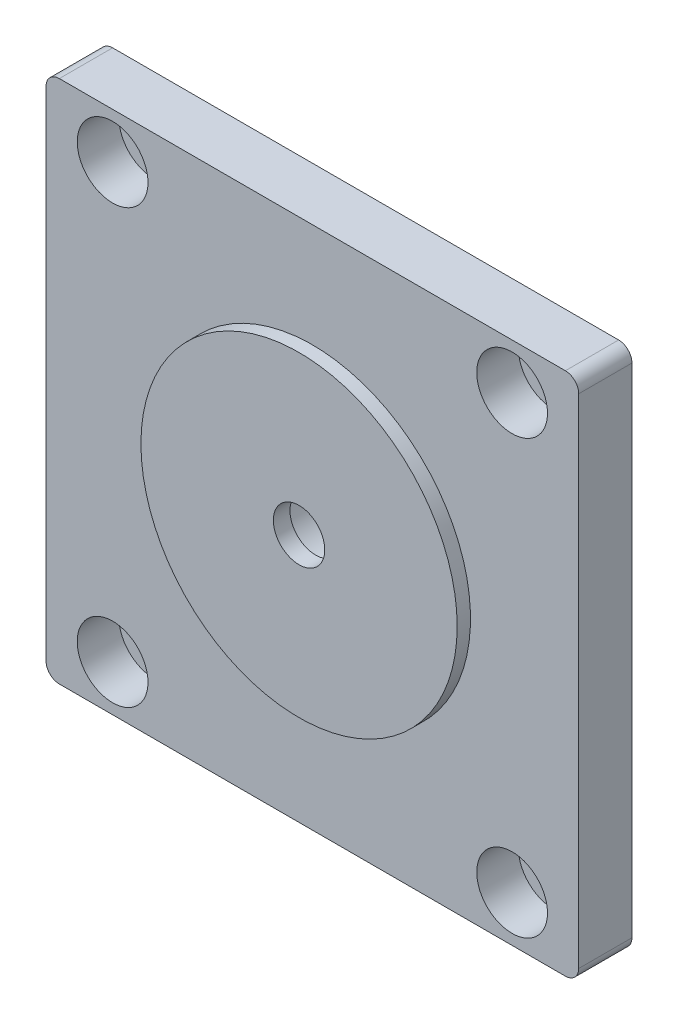
ISO-10303-21;
HEADER;
FILE_DESCRIPTION(('STEP AP214'),'2;1');
FILE_NAME('part.step','',(''),(''),'','','');
FILE_SCHEMA(('AUTOMOTIVE_DESIGN { 1 0 10303 214 1 1 1 1 }'));
ENDSEC;
DATA;
#1=APPLICATION_CONTEXT('core data for automotive mechanical design processes');
#2=APPLICATION_PROTOCOL_DEFINITION('international standard','automotive_design',2000,#1);
#3=PRODUCT_CONTEXT('',#1,'mechanical');
#4=PRODUCT('Part','Part','',(#3));
#5=PRODUCT_RELATED_PRODUCT_CATEGORY('part','',(#4));
#6=PRODUCT_DEFINITION_FORMATION('','',#4);
#7=PRODUCT_DEFINITION_CONTEXT('part definition',#1,'design');
#8=PRODUCT_DEFINITION('design','',#6,#7);
#9=PRODUCT_DEFINITION_SHAPE('','',#8);
#10=(LENGTH_UNIT() NAMED_UNIT(*) SI_UNIT(.MILLI.,.METRE.));
#11=(NAMED_UNIT(*) PLANE_ANGLE_UNIT() SI_UNIT($,.RADIAN.));
#12=(NAMED_UNIT(*) SI_UNIT($,.STERADIAN.) SOLID_ANGLE_UNIT());
#13=UNCERTAINTY_MEASURE_WITH_UNIT(LENGTH_MEASURE(1.E-05),#10,'distance_accuracy_value','');
#14=(GEOMETRIC_REPRESENTATION_CONTEXT(3) GLOBAL_UNCERTAINTY_ASSIGNED_CONTEXT((#13)) GLOBAL_UNIT_ASSIGNED_CONTEXT((#10,
#11,#12)) REPRESENTATION_CONTEXT('',''));
#15=CARTESIAN_POINT('',(0.,0.,0.));
#16=DIRECTION('',(0.,0.,1.));
#17=DIRECTION('',(1.,0.,0.));
#18=AXIS2_PLACEMENT_3D('',#15,#16,#17);
#19=CARTESIAN_POINT('',(0.,0.,10.16));
#20=DIRECTION('',(1.,0.,0.));
#21=DIRECTION('',(0.,0.,-1.));
#22=AXIS2_PLACEMENT_3D('',#19,#20,#21);
#23=PLANE('',#22);
#24=DIRECTION('',(0.,-1.,0.));
#25=VECTOR('',#24,1.);
#26=CARTESIAN_POINT('',(0.,0.,10.16));
#27=LINE('',#26,#25);
#28=CARTESIAN_POINT('',(0.,97.4725,10.16));
#29=VERTEX_POINT('',#28);
#30=CARTESIAN_POINT('',(0.,2.54,10.16));
#31=VERTEX_POINT('',#30);
#32=EDGE_CURVE('E128',#29,#31,#27,.T.);
#33=ORIENTED_EDGE('',*,*,#32,.F.);
#34=DIRECTION('',(0.,0.,-1.));
#35=VECTOR('',#34,1.);
#36=CARTESIAN_POINT('',(0.,97.4725,10.16));
#37=LINE('',#36,#35);
#38=CARTESIAN_POINT('',(0.,97.4725,0.));
#39=VERTEX_POINT('',#38);
#40=EDGE_CURVE('E155',#29,#39,#37,.T.);
#41=ORIENTED_EDGE('',*,*,#40,.T.);
#42=DIRECTION('',(0.,-1.,0.));
#43=VECTOR('',#42,1.);
#44=CARTESIAN_POINT('',(0.,0.,0.));
#45=LINE('',#44,#43);
#46=CARTESIAN_POINT('',(0.,2.54,0.));
#47=VERTEX_POINT('',#46);
#48=EDGE_CURVE('E130',#39,#47,#45,.T.);
#49=ORIENTED_EDGE('',*,*,#48,.T.);
#50=DIRECTION('',(0.,0.,-1.));
#51=VECTOR('',#50,1.);
#52=CARTESIAN_POINT('',(0.,2.54,10.16));
#53=LINE('',#52,#51);
#54=EDGE_CURVE('E153',#47,#31,#53,.F.);
#55=ORIENTED_EDGE('',*,*,#54,.T.);
#56=EDGE_LOOP('',(#33,#41,#49,#55));
#57=FACE_BOUND('',#56,.T.);
#58=ADVANCED_FACE('F35',(#57),#23,.F.);
#59=CARTESIAN_POINT('',(0.,0.,10.16));
#60=DIRECTION('',(0.,1.,0.));
#61=DIRECTION('',(0.,0.,1.));
#62=AXIS2_PLACEMENT_3D('',#59,#60,#61);
#63=PLANE('',#62);
#64=DIRECTION('',(1.,0.,0.));
#65=VECTOR('',#64,1.);
#66=CARTESIAN_POINT('',(0.,0.,0.));
#67=LINE('',#66,#65);
#68=CARTESIAN_POINT('',(2.54,0.,0.));
#69=VERTEX_POINT('',#68);
#70=CARTESIAN_POINT('',(99.06,0.,0.));
#71=VERTEX_POINT('',#70);
#72=EDGE_CURVE('E126',#69,#71,#67,.T.);
#73=ORIENTED_EDGE('',*,*,#72,.T.);
#74=DIRECTION('',(0.,0.,-1.));
#75=VECTOR('',#74,1.);
#76=CARTESIAN_POINT('',(99.06,0.,10.16));
#77=LINE('',#76,#75);
#78=CARTESIAN_POINT('',(99.06,0.,10.16));
#79=VERTEX_POINT('',#78);
#80=EDGE_CURVE('E105',#71,#79,#77,.F.);
#81=ORIENTED_EDGE('',*,*,#80,.T.);
#82=DIRECTION('',(1.,0.,0.));
#83=VECTOR('',#82,1.);
#84=CARTESIAN_POINT('',(0.,0.,10.16));
#85=LINE('',#84,#83);
#86=CARTESIAN_POINT('',(2.54,0.,10.16));
#87=VERTEX_POINT('',#86);
#88=EDGE_CURVE('E172',#87,#79,#85,.T.);
#89=ORIENTED_EDGE('',*,*,#88,.F.);
#90=DIRECTION('',(0.,0.,-1.));
#91=VECTOR('',#90,1.);
#92=CARTESIAN_POINT('',(2.54,0.,10.16));
#93=LINE('',#92,#91);
#94=EDGE_CURVE('E110',#87,#69,#93,.T.);
#95=ORIENTED_EDGE('',*,*,#94,.T.);
#96=EDGE_LOOP('',(#73,#81,#89,#95));
#97=FACE_BOUND('',#96,.T.);
#98=ADVANCED_FACE('F288',(#97),#63,.F.);
#99=CARTESIAN_POINT('',(101.6,0.,10.16));
#100=DIRECTION('',(-1.,0.,0.));
#101=DIRECTION('',(0.,0.,1.));
#102=AXIS2_PLACEMENT_3D('',#99,#100,#101);
#103=PLANE('',#102);
#104=DIRECTION('',(0.,1.,0.));
#105=VECTOR('',#104,1.);
#106=CARTESIAN_POINT('',(101.6,0.,10.16));
#107=LINE('',#106,#105);
#108=CARTESIAN_POINT('',(101.6,2.54,10.16));
#109=VERTEX_POINT('',#108);
#110=CARTESIAN_POINT('',(101.6,97.4725,10.16));
#111=VERTEX_POINT('',#110);
#112=EDGE_CURVE('E119',#109,#111,#107,.T.);
#113=ORIENTED_EDGE('',*,*,#112,.F.);
#114=DIRECTION('',(0.,0.,-1.));
#115=VECTOR('',#114,1.);
#116=CARTESIAN_POINT('',(101.6,2.54,10.16));
#117=LINE('',#116,#115);
#118=CARTESIAN_POINT('',(101.6,2.54,0.));
#119=VERTEX_POINT('',#118);
#120=EDGE_CURVE('E104',#109,#119,#117,.T.);
#121=ORIENTED_EDGE('',*,*,#120,.T.);
#122=DIRECTION('',(0.,1.,0.));
#123=VECTOR('',#122,1.);
#124=CARTESIAN_POINT('',(101.6,0.,0.));
#125=LINE('',#124,#123);
#126=CARTESIAN_POINT('',(101.6,97.4725,0.));
#127=VERTEX_POINT('',#126);
#128=EDGE_CURVE('E117',#119,#127,#125,.T.);
#129=ORIENTED_EDGE('',*,*,#128,.T.);
#130=DIRECTION('',(0.,0.,-1.));
#131=VECTOR('',#130,1.);
#132=CARTESIAN_POINT('',(101.6,97.4725,10.16));
#133=LINE('',#132,#131);
#134=EDGE_CURVE('E121',#127,#111,#133,.F.);
#135=ORIENTED_EDGE('',*,*,#134,.T.);
#136=EDGE_LOOP('',(#113,#121,#129,#135));
#137=FACE_BOUND('',#136,.T.);
#138=ADVANCED_FACE('F116',(#137),#103,.F.);
#139=CARTESIAN_POINT('',(0.,100.0125,10.16));
#140=DIRECTION('',(0.,-1.,0.));
#141=DIRECTION('',(0.,0.,-1.));
#142=AXIS2_PLACEMENT_3D('',#139,#140,#141);
#143=PLANE('',#142);
#144=DIRECTION('',(-1.,0.,0.));
#145=VECTOR('',#144,1.);
#146=CARTESIAN_POINT('',(0.,100.0125,0.));
#147=LINE('',#146,#145);
#148=CARTESIAN_POINT('',(99.06,100.0125,0.));
#149=VERTEX_POINT('',#148);
#150=CARTESIAN_POINT('',(2.54,100.0125,0.));
#151=VERTEX_POINT('',#150);
#152=EDGE_CURVE('E125',#149,#151,#147,.T.);
#153=ORIENTED_EDGE('',*,*,#152,.T.);
#154=DIRECTION('',(0.,0.,-1.));
#155=VECTOR('',#154,1.);
#156=CARTESIAN_POINT('',(2.54,100.0125,10.16));
#157=LINE('',#156,#155);
#158=CARTESIAN_POINT('',(2.54,100.0125,10.16));
#159=VERTEX_POINT('',#158);
#160=EDGE_CURVE('E11',#151,#159,#157,.F.);
#161=ORIENTED_EDGE('',*,*,#160,.T.);
#162=DIRECTION('',(-1.,0.,0.));
#163=VECTOR('',#162,1.);
#164=CARTESIAN_POINT('',(0.,100.0125,10.16));
#165=LINE('',#164,#163);
#166=CARTESIAN_POINT('',(99.06,100.0125,10.16));
#167=VERTEX_POINT('',#166);
#168=EDGE_CURVE('E137',#167,#159,#165,.T.);
#169=ORIENTED_EDGE('',*,*,#168,.F.);
#170=DIRECTION('',(0.,0.,-1.));
#171=VECTOR('',#170,1.);
#172=CARTESIAN_POINT('',(99.06,100.0125,10.16));
#173=LINE('',#172,#171);
#174=EDGE_CURVE('E43',#167,#149,#173,.T.);
#175=ORIENTED_EDGE('',*,*,#174,.T.);
#176=EDGE_LOOP('',(#153,#161,#169,#175));
#177=FACE_BOUND('',#176,.T.);
#178=ADVANCED_FACE('F159',(#177),#143,.F.);
#179=CARTESIAN_POINT('',(0.,0.,10.16));
#180=DIRECTION('',(0.,0.,-1.));
#181=DIRECTION('',(-1.,0.,0.));
#182=AXIS2_PLACEMENT_3D('',#179,#180,#181);
#183=PLANE('',#182);
#184=CARTESIAN_POINT('',(50.8,50.00625,10.16));
#185=DIRECTION('',(0.,0.,-1.));
#186=DIRECTION('',(-1.,0.,0.));
#187=AXIS2_PLACEMENT_3D('',#184,#185,#186);
#188=CIRCLE('',#187,30.1625);
#189=CARTESIAN_POINT('',(20.6375,50.00625,10.16));
#190=VERTEX_POINT('',#189);
#191=EDGE_CURVE('E134',#190,#190,#188,.F.);
#192=ORIENTED_EDGE('',*,*,#191,.F.);
#193=EDGE_LOOP('',(#192));
#194=FACE_BOUND('',#193,.T.);
#195=CARTESIAN_POINT('',(88.9,91.28125,10.16));
#196=DIRECTION('',(0.,0.,1.));
#197=DIRECTION('',(1.,0.,0.));
#198=AXIS2_PLACEMENT_3D('',#195,#196,#197);
#199=CIRCLE('',#198,6.74751);
#200=CARTESIAN_POINT('',(95.64751,91.28125,10.16));
#201=VERTEX_POINT('',#200);
#202=EDGE_CURVE('E228',#201,#201,#199,.T.);
#203=ORIENTED_EDGE('',*,*,#202,.F.);
#204=EDGE_LOOP('',(#203));
#205=FACE_BOUND('',#204,.T.);
#206=CARTESIAN_POINT('',(12.7,8.73125,10.16));
#207=DIRECTION('',(0.,0.,1.));
#208=DIRECTION('',(1.,0.,0.));
#209=AXIS2_PLACEMENT_3D('',#206,#207,#208);
#210=CIRCLE('',#209,6.74751);
#211=CARTESIAN_POINT('',(19.44751,8.73125,10.16));
#212=VERTEX_POINT('',#211);
#213=EDGE_CURVE('E216',#212,#212,#210,.T.);
#214=ORIENTED_EDGE('',*,*,#213,.F.);
#215=EDGE_LOOP('',(#214));
#216=FACE_BOUND('',#215,.T.);
#217=CARTESIAN_POINT('',(12.7,91.28125,10.16));
#218=DIRECTION('',(0.,0.,1.));
#219=DIRECTION('',(1.,0.,0.));
#220=AXIS2_PLACEMENT_3D('',#217,#218,#219);
#221=CIRCLE('',#220,6.74751);
#222=CARTESIAN_POINT('',(19.44751,91.28125,10.16));
#223=VERTEX_POINT('',#222);
#224=EDGE_CURVE('E204',#223,#223,#221,.T.);
#225=ORIENTED_EDGE('',*,*,#224,.F.);
#226=EDGE_LOOP('',(#225));
#227=FACE_BOUND('',#226,.T.);
#228=CARTESIAN_POINT('',(88.9,8.73125,10.16));
#229=DIRECTION('',(0.,0.,1.));
#230=DIRECTION('',(1.,0.,0.));
#231=AXIS2_PLACEMENT_3D('',#228,#229,#230);
#232=CIRCLE('',#231,6.74751);
#233=CARTESIAN_POINT('',(95.64751,8.73125,10.16));
#234=VERTEX_POINT('',#233);
#235=EDGE_CURVE('E190',#234,#234,#232,.T.);
#236=ORIENTED_EDGE('',*,*,#235,.F.);
#237=EDGE_LOOP('',(#236));
#238=FACE_BOUND('',#237,.T.);
#239=ORIENTED_EDGE('',*,*,#88,.T.);
#240=CARTESIAN_POINT('',(99.06,2.54,10.16));
#241=DIRECTION('',(0.,0.,-1.));
#242=DIRECTION('',(-1.,0.,0.));
#243=AXIS2_PLACEMENT_3D('',#240,#241,#242);
#244=CIRCLE('',#243,2.54);
#245=EDGE_CURVE('E151',#79,#109,#244,.F.);
#246=ORIENTED_EDGE('',*,*,#245,.T.);
#247=ORIENTED_EDGE('',*,*,#112,.T.);
#248=CARTESIAN_POINT('',(99.06,97.4725,10.16));
#249=DIRECTION('',(0.,0.,-1.));
#250=DIRECTION('',(-1.,0.,0.));
#251=AXIS2_PLACEMENT_3D('',#248,#249,#250);
#252=CIRCLE('',#251,2.54);
#253=EDGE_CURVE('E55',#111,#167,#252,.F.);
#254=ORIENTED_EDGE('',*,*,#253,.T.);
#255=ORIENTED_EDGE('',*,*,#168,.T.);
#256=CARTESIAN_POINT('',(2.54,97.4725,10.16));
#257=DIRECTION('',(0.,0.,-1.));
#258=DIRECTION('',(-1.,0.,0.));
#259=AXIS2_PLACEMENT_3D('',#256,#257,#258);
#260=CIRCLE('',#259,2.54);
#261=EDGE_CURVE('E149',#159,#29,#260,.F.);
#262=ORIENTED_EDGE('',*,*,#261,.T.);
#263=ORIENTED_EDGE('',*,*,#32,.T.);
#264=CARTESIAN_POINT('',(2.54,2.54,10.16));
#265=DIRECTION('',(0.,0.,-1.));
#266=DIRECTION('',(-1.,0.,0.));
#267=AXIS2_PLACEMENT_3D('',#264,#265,#266);
#268=CIRCLE('',#267,2.54);
#269=EDGE_CURVE('E147',#31,#87,#268,.F.);
#270=ORIENTED_EDGE('',*,*,#269,.T.);
#271=EDGE_LOOP('',(#239,#246,#247,#254,#255,#262,#263,#270));
#272=FACE_BOUND('',#271,.T.);
#273=ADVANCED_FACE('F252',(#194,#205,#216,#227,#238,#272),#183,.F.);
#274=CARTESIAN_POINT('',(0.,0.,0.));
#275=DIRECTION('',(0.,0.,-1.));
#276=DIRECTION('',(-1.,0.,0.));
#277=AXIS2_PLACEMENT_3D('',#274,#275,#276);
#278=PLANE('',#277);
#279=CARTESIAN_POINT('',(50.8,50.00625,0.));
#280=DIRECTION('',(0.,0.,-1.));
#281=DIRECTION('',(-1.,0.,0.));
#282=AXIS2_PLACEMENT_3D('',#279,#280,#281);
#283=CIRCLE('',#282,7.9375);
#284=CARTESIAN_POINT('',(42.8625,50.00625,0.));
#285=VERTEX_POINT('',#284);
#286=EDGE_CURVE('E243',#285,#285,#283,.T.);
#287=ORIENTED_EDGE('',*,*,#286,.F.);
#288=EDGE_LOOP('',(#287));
#289=FACE_BOUND('',#288,.T.);
#290=CARTESIAN_POINT('',(88.9,91.28125,0.));
#291=DIRECTION('',(0.,0.,1.));
#292=DIRECTION('',(1.,0.,0.));
#293=AXIS2_PLACEMENT_3D('',#290,#291,#292);
#294=CIRCLE('',#293,4.1021);
#295=CARTESIAN_POINT('',(93.0021,91.28125,0.));
#296=VERTEX_POINT('',#295);
#297=EDGE_CURVE('E219',#296,#296,#294,.T.);
#298=ORIENTED_EDGE('',*,*,#297,.T.);
#299=EDGE_LOOP('',(#298));
#300=FACE_BOUND('',#299,.T.);
#301=CARTESIAN_POINT('',(12.7,8.73125,0.));
#302=DIRECTION('',(0.,0.,1.));
#303=DIRECTION('',(1.,0.,0.));
#304=AXIS2_PLACEMENT_3D('',#301,#302,#303);
#305=CIRCLE('',#304,4.1021);
#306=CARTESIAN_POINT('',(16.8021,8.73125,0.));
#307=VERTEX_POINT('',#306);
#308=EDGE_CURVE('E207',#307,#307,#305,.T.);
#309=ORIENTED_EDGE('',*,*,#308,.T.);
#310=EDGE_LOOP('',(#309));
#311=FACE_BOUND('',#310,.T.);
#312=CARTESIAN_POINT('',(12.7,91.28125,0.));
#313=DIRECTION('',(0.,0.,1.));
#314=DIRECTION('',(1.,0.,0.));
#315=AXIS2_PLACEMENT_3D('',#312,#313,#314);
#316=CIRCLE('',#315,4.1021);
#317=CARTESIAN_POINT('',(16.8021,91.28125,0.));
#318=VERTEX_POINT('',#317);
#319=EDGE_CURVE('E195',#318,#318,#316,.T.);
#320=ORIENTED_EDGE('',*,*,#319,.T.);
#321=EDGE_LOOP('',(#320));
#322=FACE_BOUND('',#321,.T.);
#323=CARTESIAN_POINT('',(88.9,8.73125,0.));
#324=DIRECTION('',(0.,0.,1.));
#325=DIRECTION('',(1.,0.,0.));
#326=AXIS2_PLACEMENT_3D('',#323,#324,#325);
#327=CIRCLE('',#326,4.1021);
#328=CARTESIAN_POINT('',(93.0021,8.73125,0.));
#329=VERTEX_POINT('',#328);
#330=EDGE_CURVE('E177',#329,#329,#327,.T.);
#331=ORIENTED_EDGE('',*,*,#330,.T.);
#332=EDGE_LOOP('',(#331));
#333=FACE_BOUND('',#332,.T.);
#334=ORIENTED_EDGE('',*,*,#128,.F.);
#335=CARTESIAN_POINT('',(99.06,2.54,0.));
#336=DIRECTION('',(0.,0.,-1.));
#337=DIRECTION('',(-1.,0.,0.));
#338=AXIS2_PLACEMENT_3D('',#335,#336,#337);
#339=CIRCLE('',#338,2.54);
#340=EDGE_CURVE('E100',#119,#71,#339,.T.);
#341=ORIENTED_EDGE('',*,*,#340,.T.);
#342=ORIENTED_EDGE('',*,*,#72,.F.);
#343=CARTESIAN_POINT('',(2.54,2.54,0.));
#344=DIRECTION('',(0.,0.,-1.));
#345=DIRECTION('',(-1.,0.,0.));
#346=AXIS2_PLACEMENT_3D('',#343,#344,#345);
#347=CIRCLE('',#346,2.54);
#348=EDGE_CURVE('E140',#69,#47,#347,.T.);
#349=ORIENTED_EDGE('',*,*,#348,.T.);
#350=ORIENTED_EDGE('',*,*,#48,.F.);
#351=CARTESIAN_POINT('',(2.54,97.4725,0.));
#352=DIRECTION('',(0.,0.,-1.));
#353=DIRECTION('',(-1.,0.,0.));
#354=AXIS2_PLACEMENT_3D('',#351,#352,#353);
#355=CIRCLE('',#354,2.54);
#356=EDGE_CURVE('E111',#39,#151,#355,.T.);
#357=ORIENTED_EDGE('',*,*,#356,.T.);
#358=ORIENTED_EDGE('',*,*,#152,.F.);
#359=CARTESIAN_POINT('',(99.06,97.4725,0.));
#360=DIRECTION('',(0.,0.,-1.));
#361=DIRECTION('',(-1.,0.,0.));
#362=AXIS2_PLACEMENT_3D('',#359,#360,#361);
#363=CIRCLE('',#362,2.54);
#364=EDGE_CURVE('E120',#149,#127,#363,.T.);
#365=ORIENTED_EDGE('',*,*,#364,.T.);
#366=EDGE_LOOP('',(#334,#341,#342,#349,#350,#357,#358,#365));
#367=FACE_BOUND('',#366,.T.);
#368=ADVANCED_FACE('F123',(#289,#300,#311,#322,#333,#367),#278,.T.);
#369=CARTESIAN_POINT('',(88.9,8.73125,10.16));
#370=DIRECTION('',(0.,0.,1.));
#371=DIRECTION('',(1.,0.,0.));
#372=AXIS2_PLACEMENT_3D('',#369,#370,#371);
#373=CYLINDRICAL_SURFACE('',#372,4.1021);
#374=ORIENTED_EDGE('',*,*,#330,.F.);
#375=EDGE_LOOP('',(#374));
#376=FACE_BOUND('',#375,.T.);
#377=CARTESIAN_POINT('',(88.9,8.73125,2.2225));
#378=DIRECTION('',(0.,0.,1.));
#379=DIRECTION('',(1.,0.,0.));
#380=AXIS2_PLACEMENT_3D('',#377,#378,#379);
#381=CIRCLE('',#380,4.1021);
#382=CARTESIAN_POINT('',(93.0021,8.73125,2.2225));
#383=VERTEX_POINT('',#382);
#384=EDGE_CURVE('E182',#383,#383,#381,.T.);
#385=ORIENTED_EDGE('',*,*,#384,.T.);
#386=EDGE_LOOP('',(#385));
#387=FACE_BOUND('',#386,.T.);
#388=ADVANCED_FACE('F251',(#376,#387),#373,.F.);
#389=CARTESIAN_POINT('',(93.0021,8.73125,2.2225));
#390=DIRECTION('',(0.,0.,-1.));
#391=DIRECTION('',(-1.,0.,0.));
#392=AXIS2_PLACEMENT_3D('',#389,#390,#391);
#393=PLANE('',#392);
#394=ORIENTED_EDGE('',*,*,#384,.F.);
#395=EDGE_LOOP('',(#394));
#396=FACE_BOUND('',#395,.T.);
#397=CARTESIAN_POINT('',(88.9,8.73125,2.2225));
#398=DIRECTION('',(0.,0.,1.));
#399=DIRECTION('',(1.,0.,0.));
#400=AXIS2_PLACEMENT_3D('',#397,#398,#399);
#401=CIRCLE('',#400,6.74751);
#402=CARTESIAN_POINT('',(95.64751,8.73125,2.2225));
#403=VERTEX_POINT('',#402);
#404=EDGE_CURVE('E186',#403,#403,#401,.T.);
#405=ORIENTED_EDGE('',*,*,#404,.T.);
#406=EDGE_LOOP('',(#405));
#407=FACE_BOUND('',#406,.T.);
#408=ADVANCED_FACE('F356',(#396,#407),#393,.F.);
#409=CARTESIAN_POINT('',(88.9,8.73125,10.16));
#410=DIRECTION('',(0.,0.,1.));
#411=DIRECTION('',(1.,0.,0.));
#412=AXIS2_PLACEMENT_3D('',#409,#410,#411);
#413=CYLINDRICAL_SURFACE('',#412,6.74751);
#414=ORIENTED_EDGE('',*,*,#404,.F.);
#415=EDGE_LOOP('',(#414));
#416=FACE_BOUND('',#415,.T.);
#417=ORIENTED_EDGE('',*,*,#235,.T.);
#418=EDGE_LOOP('',(#417));
#419=FACE_BOUND('',#418,.T.);
#420=ADVANCED_FACE('F264',(#416,#419),#413,.F.);
#421=CARTESIAN_POINT('',(12.7,91.28125,10.16));
#422=DIRECTION('',(0.,0.,1.));
#423=DIRECTION('',(1.,0.,0.));
#424=AXIS2_PLACEMENT_3D('',#421,#422,#423);
#425=CYLINDRICAL_SURFACE('',#424,4.1021);
#426=ORIENTED_EDGE('',*,*,#319,.F.);
#427=EDGE_LOOP('',(#426));
#428=FACE_BOUND('',#427,.T.);
#429=CARTESIAN_POINT('',(12.7,91.28125,2.2225));
#430=DIRECTION('',(0.,0.,1.));
#431=DIRECTION('',(1.,0.,0.));
#432=AXIS2_PLACEMENT_3D('',#429,#430,#431);
#433=CIRCLE('',#432,4.1021);
#434=CARTESIAN_POINT('',(16.8021,91.28125,2.2225));
#435=VERTEX_POINT('',#434);
#436=EDGE_CURVE('E198',#435,#435,#433,.T.);
#437=ORIENTED_EDGE('',*,*,#436,.T.);
#438=EDGE_LOOP('',(#437));
#439=FACE_BOUND('',#438,.T.);
#440=ADVANCED_FACE('F260',(#428,#439),#425,.F.);
#441=CARTESIAN_POINT('',(16.8021,91.28125,2.2225));
#442=DIRECTION('',(0.,0.,-1.));
#443=DIRECTION('',(-1.,0.,0.));
#444=AXIS2_PLACEMENT_3D('',#441,#442,#443);
#445=PLANE('',#444);
#446=ORIENTED_EDGE('',*,*,#436,.F.);
#447=EDGE_LOOP('',(#446));
#448=FACE_BOUND('',#447,.T.);
#449=CARTESIAN_POINT('',(12.7,91.28125,2.2225));
#450=DIRECTION('',(0.,0.,1.));
#451=DIRECTION('',(1.,0.,0.));
#452=AXIS2_PLACEMENT_3D('',#449,#450,#451);
#453=CIRCLE('',#452,6.74751);
#454=CARTESIAN_POINT('',(19.44751,91.28125,2.2225));
#455=VERTEX_POINT('',#454);
#456=EDGE_CURVE('E201',#455,#455,#453,.T.);
#457=ORIENTED_EDGE('',*,*,#456,.T.);
#458=EDGE_LOOP('',(#457));
#459=FACE_BOUND('',#458,.T.);
#460=ADVANCED_FACE('F263',(#448,#459),#445,.F.);
#461=CARTESIAN_POINT('',(12.7,91.28125,10.16));
#462=DIRECTION('',(0.,0.,1.));
#463=DIRECTION('',(1.,0.,0.));
#464=AXIS2_PLACEMENT_3D('',#461,#462,#463);
#465=CYLINDRICAL_SURFACE('',#464,6.74751);
#466=ORIENTED_EDGE('',*,*,#456,.F.);
#467=EDGE_LOOP('',(#466));
#468=FACE_BOUND('',#467,.T.);
#469=ORIENTED_EDGE('',*,*,#224,.T.);
#470=EDGE_LOOP('',(#469));
#471=FACE_BOUND('',#470,.T.);
#472=ADVANCED_FACE('F270',(#468,#471),#465,.F.);
#473=CARTESIAN_POINT('',(12.7,8.73125,10.16));
#474=DIRECTION('',(0.,0.,1.));
#475=DIRECTION('',(1.,0.,0.));
#476=AXIS2_PLACEMENT_3D('',#473,#474,#475);
#477=CYLINDRICAL_SURFACE('',#476,4.1021);
#478=ORIENTED_EDGE('',*,*,#308,.F.);
#479=EDGE_LOOP('',(#478));
#480=FACE_BOUND('',#479,.T.);
#481=CARTESIAN_POINT('',(12.7,8.73125,2.2225));
#482=DIRECTION('',(0.,0.,1.));
#483=DIRECTION('',(1.,0.,0.));
#484=AXIS2_PLACEMENT_3D('',#481,#482,#483);
#485=CIRCLE('',#484,4.1021);
#486=CARTESIAN_POINT('',(16.8021,8.73125,2.2225));
#487=VERTEX_POINT('',#486);
#488=EDGE_CURVE('E210',#487,#487,#485,.T.);
#489=ORIENTED_EDGE('',*,*,#488,.T.);
#490=EDGE_LOOP('',(#489));
#491=FACE_BOUND('',#490,.T.);
#492=ADVANCED_FACE('F276',(#480,#491),#477,.F.);
#493=CARTESIAN_POINT('',(16.8021,8.73125,2.2225));
#494=DIRECTION('',(0.,0.,-1.));
#495=DIRECTION('',(-1.,0.,0.));
#496=AXIS2_PLACEMENT_3D('',#493,#494,#495);
#497=PLANE('',#496);
#498=ORIENTED_EDGE('',*,*,#488,.F.);
#499=EDGE_LOOP('',(#498));
#500=FACE_BOUND('',#499,.T.);
#501=CARTESIAN_POINT('',(12.7,8.73125,2.2225));
#502=DIRECTION('',(0.,0.,1.));
#503=DIRECTION('',(1.,0.,0.));
#504=AXIS2_PLACEMENT_3D('',#501,#502,#503);
#505=CIRCLE('',#504,6.74751);
#506=CARTESIAN_POINT('',(19.44751,8.73125,2.2225));
#507=VERTEX_POINT('',#506);
#508=EDGE_CURVE('E213',#507,#507,#505,.T.);
#509=ORIENTED_EDGE('',*,*,#508,.T.);
#510=EDGE_LOOP('',(#509));
#511=FACE_BOUND('',#510,.T.);
#512=ADVANCED_FACE('F346',(#500,#511),#497,.F.);
#513=CARTESIAN_POINT('',(12.7,8.73125,10.16));
#514=DIRECTION('',(0.,0.,1.));
#515=DIRECTION('',(1.,0.,0.));
#516=AXIS2_PLACEMENT_3D('',#513,#514,#515);
#517=CYLINDRICAL_SURFACE('',#516,6.74751);
#518=ORIENTED_EDGE('',*,*,#508,.F.);
#519=EDGE_LOOP('',(#518));
#520=FACE_BOUND('',#519,.T.);
#521=ORIENTED_EDGE('',*,*,#213,.T.);
#522=EDGE_LOOP('',(#521));
#523=FACE_BOUND('',#522,.T.);
#524=ADVANCED_FACE('F342',(#520,#523),#517,.F.);
#525=CARTESIAN_POINT('',(88.9,91.28125,10.16));
#526=DIRECTION('',(0.,0.,1.));
#527=DIRECTION('',(1.,0.,0.));
#528=AXIS2_PLACEMENT_3D('',#525,#526,#527);
#529=CYLINDRICAL_SURFACE('',#528,4.1021);
#530=ORIENTED_EDGE('',*,*,#297,.F.);
#531=EDGE_LOOP('',(#530));
#532=FACE_BOUND('',#531,.T.);
#533=CARTESIAN_POINT('',(88.9,91.28125,2.2225));
#534=DIRECTION('',(0.,0.,1.));
#535=DIRECTION('',(1.,0.,0.));
#536=AXIS2_PLACEMENT_3D('',#533,#534,#535);
#537=CIRCLE('',#536,4.1021);
#538=CARTESIAN_POINT('',(93.0021,91.28125,2.2225));
#539=VERTEX_POINT('',#538);
#540=EDGE_CURVE('E222',#539,#539,#537,.T.);
#541=ORIENTED_EDGE('',*,*,#540,.T.);
#542=EDGE_LOOP('',(#541));
#543=FACE_BOUND('',#542,.T.);
#544=ADVANCED_FACE('F338',(#532,#543),#529,.F.);
#545=CARTESIAN_POINT('',(93.0021,91.28125,2.2225));
#546=DIRECTION('',(0.,0.,-1.));
#547=DIRECTION('',(-1.,0.,0.));
#548=AXIS2_PLACEMENT_3D('',#545,#546,#547);
#549=PLANE('',#548);
#550=ORIENTED_EDGE('',*,*,#540,.F.);
#551=EDGE_LOOP('',(#550));
#552=FACE_BOUND('',#551,.T.);
#553=CARTESIAN_POINT('',(88.9,91.28125,2.2225));
#554=DIRECTION('',(0.,0.,1.));
#555=DIRECTION('',(1.,0.,0.));
#556=AXIS2_PLACEMENT_3D('',#553,#554,#555);
#557=CIRCLE('',#556,6.74751);
#558=CARTESIAN_POINT('',(95.64751,91.28125,2.2225));
#559=VERTEX_POINT('',#558);
#560=EDGE_CURVE('E225',#559,#559,#557,.T.);
#561=ORIENTED_EDGE('',*,*,#560,.T.);
#562=EDGE_LOOP('',(#561));
#563=FACE_BOUND('',#562,.T.);
#564=ADVANCED_FACE('F334',(#552,#563),#549,.F.);
#565=CARTESIAN_POINT('',(88.9,91.28125,10.16));
#566=DIRECTION('',(0.,0.,1.));
#567=DIRECTION('',(1.,0.,0.));
#568=AXIS2_PLACEMENT_3D('',#565,#566,#567);
#569=CYLINDRICAL_SURFACE('',#568,6.74751);
#570=ORIENTED_EDGE('',*,*,#560,.F.);
#571=EDGE_LOOP('',(#570));
#572=FACE_BOUND('',#571,.T.);
#573=ORIENTED_EDGE('',*,*,#202,.T.);
#574=EDGE_LOOP('',(#573));
#575=FACE_BOUND('',#574,.T.);
#576=ADVANCED_FACE('F330',(#572,#575),#569,.F.);
#577=CARTESIAN_POINT('',(50.8,50.00625,12.7));
#578=DIRECTION('',(0.,0.,-1.));
#579=DIRECTION('',(-1.,0.,0.));
#580=AXIS2_PLACEMENT_3D('',#577,#578,#579);
#581=CYLINDRICAL_SURFACE('',#580,30.1625);
#582=CARTESIAN_POINT('',(50.8,50.00625,12.7));
#583=DIRECTION('',(0.,0.,1.));
#584=DIRECTION('',(1.,0.,0.));
#585=AXIS2_PLACEMENT_3D('',#582,#583,#584);
#586=CIRCLE('',#585,30.1625);
#587=CARTESIAN_POINT('',(80.9625,50.00625,12.7));
#588=VERTEX_POINT('',#587);
#589=EDGE_CURVE('E231',#588,#588,#586,.T.);
#590=ORIENTED_EDGE('',*,*,#589,.F.);
#591=EDGE_LOOP('',(#590));
#592=FACE_BOUND('',#591,.T.);
#593=ORIENTED_EDGE('',*,*,#191,.T.);
#594=EDGE_LOOP('',(#593));
#595=FACE_BOUND('',#594,.T.);
#596=ADVANCED_FACE('F326',(#592,#595),#581,.T.);
#597=CARTESIAN_POINT('',(50.8,50.00625,12.7));
#598=DIRECTION('',(0.,0.,1.));
#599=DIRECTION('',(1.,0.,0.));
#600=AXIS2_PLACEMENT_3D('',#597,#598,#599);
#601=PLANE('',#600);
#602=CARTESIAN_POINT('',(50.8,50.00625,12.7));
#603=DIRECTION('',(0.,0.,-1.));
#604=DIRECTION('',(-1.,0.,0.));
#605=AXIS2_PLACEMENT_3D('',#602,#603,#604);
#606=CIRCLE('',#605,4.9022);
#607=CARTESIAN_POINT('',(45.8978,50.00625,12.7));
#608=VERTEX_POINT('',#607);
#609=EDGE_CURVE('E234',#608,#608,#606,.T.);
#610=ORIENTED_EDGE('',*,*,#609,.T.);
#611=EDGE_LOOP('',(#610));
#612=FACE_BOUND('',#611,.T.);
#613=ORIENTED_EDGE('',*,*,#589,.T.);
#614=EDGE_LOOP('',(#613));
#615=FACE_BOUND('',#614,.T.);
#616=ADVANCED_FACE('F322',(#612,#615),#601,.T.);
#617=CARTESIAN_POINT('',(50.8,50.00625,0.));
#618=DIRECTION('',(0.,0.,-1.));
#619=DIRECTION('',(-1.,0.,0.));
#620=AXIS2_PLACEMENT_3D('',#617,#618,#619);
#621=CYLINDRICAL_SURFACE('',#620,4.9022);
#622=ORIENTED_EDGE('',*,*,#609,.F.);
#623=EDGE_LOOP('',(#622));
#624=FACE_BOUND('',#623,.T.);
#625=CARTESIAN_POINT('',(50.8,50.00625,9.525));
#626=DIRECTION('',(0.,0.,-1.));
#627=DIRECTION('',(-1.,0.,0.));
#628=AXIS2_PLACEMENT_3D('',#625,#626,#627);
#629=CIRCLE('',#628,4.9022);
#630=CARTESIAN_POINT('',(45.8978,50.00625,9.525));
#631=VERTEX_POINT('',#630);
#632=EDGE_CURVE('E237',#631,#631,#629,.T.);
#633=ORIENTED_EDGE('',*,*,#632,.T.);
#634=EDGE_LOOP('',(#633));
#635=FACE_BOUND('',#634,.T.);
#636=ADVANCED_FACE('F315',(#624,#635),#621,.F.);
#637=CARTESIAN_POINT('',(55.7022,50.00625,9.525));
#638=DIRECTION('',(0.,0.,1.));
#639=DIRECTION('',(1.,0.,0.));
#640=AXIS2_PLACEMENT_3D('',#637,#638,#639);
#641=PLANE('',#640);
#642=ORIENTED_EDGE('',*,*,#632,.F.);
#643=EDGE_LOOP('',(#642));
#644=FACE_BOUND('',#643,.T.);
#645=CARTESIAN_POINT('',(50.8,50.00625,9.525));
#646=DIRECTION('',(0.,0.,-1.));
#647=DIRECTION('',(-1.,0.,0.));
#648=AXIS2_PLACEMENT_3D('',#645,#646,#647);
#649=CIRCLE('',#648,7.9375);
#650=CARTESIAN_POINT('',(42.8625,50.00625,9.525));
#651=VERTEX_POINT('',#650);
#652=EDGE_CURVE('E240',#651,#651,#649,.T.);
#653=ORIENTED_EDGE('',*,*,#652,.T.);
#654=EDGE_LOOP('',(#653));
#655=FACE_BOUND('',#654,.T.);
#656=ADVANCED_FACE('F309',(#644,#655),#641,.F.);
#657=CARTESIAN_POINT('',(50.8,50.00625,0.));
#658=DIRECTION('',(0.,0.,-1.));
#659=DIRECTION('',(-1.,0.,0.));
#660=AXIS2_PLACEMENT_3D('',#657,#658,#659);
#661=CYLINDRICAL_SURFACE('',#660,7.9375);
#662=ORIENTED_EDGE('',*,*,#652,.F.);
#663=EDGE_LOOP('',(#662));
#664=FACE_BOUND('',#663,.T.);
#665=ORIENTED_EDGE('',*,*,#286,.T.);
#666=EDGE_LOOP('',(#665));
#667=FACE_BOUND('',#666,.T.);
#668=ADVANCED_FACE('F247',(#664,#667),#661,.F.);
#669=CARTESIAN_POINT('',(99.06,2.54,10.16));
#670=DIRECTION('',(0.,0.,-1.));
#671=DIRECTION('',(-1.,0.,0.));
#672=AXIS2_PLACEMENT_3D('',#669,#670,#671);
#673=CYLINDRICAL_SURFACE('',#672,2.54);
#674=ORIENTED_EDGE('',*,*,#245,.F.);
#675=ORIENTED_EDGE('',*,*,#80,.F.);
#676=ORIENTED_EDGE('',*,*,#340,.F.);
#677=ORIENTED_EDGE('',*,*,#120,.F.);
#678=EDGE_LOOP('',(#674,#675,#676,#677));
#679=FACE_BOUND('',#678,.T.);
#680=ADVANCED_FACE('F103',(#679),#673,.T.);
#681=CARTESIAN_POINT('',(2.54,97.4725,10.16));
#682=DIRECTION('',(0.,0.,-1.));
#683=DIRECTION('',(-1.,0.,0.));
#684=AXIS2_PLACEMENT_3D('',#681,#682,#683);
#685=CYLINDRICAL_SURFACE('',#684,2.54);
#686=ORIENTED_EDGE('',*,*,#261,.F.);
#687=ORIENTED_EDGE('',*,*,#160,.F.);
#688=ORIENTED_EDGE('',*,*,#356,.F.);
#689=ORIENTED_EDGE('',*,*,#40,.F.);
#690=EDGE_LOOP('',(#686,#687,#688,#689));
#691=FACE_BOUND('',#690,.T.);
#692=ADVANCED_FACE('F166',(#691),#685,.T.);
#693=CARTESIAN_POINT('',(2.54,2.54,10.16));
#694=DIRECTION('',(0.,0.,-1.));
#695=DIRECTION('',(-1.,0.,0.));
#696=AXIS2_PLACEMENT_3D('',#693,#694,#695);
#697=CYLINDRICAL_SURFACE('',#696,2.54);
#698=ORIENTED_EDGE('',*,*,#269,.F.);
#699=ORIENTED_EDGE('',*,*,#54,.F.);
#700=ORIENTED_EDGE('',*,*,#348,.F.);
#701=ORIENTED_EDGE('',*,*,#94,.F.);
#702=EDGE_LOOP('',(#698,#699,#700,#701));
#703=FACE_BOUND('',#702,.T.);
#704=ADVANCED_FACE('F290',(#703),#697,.T.);
#705=CARTESIAN_POINT('',(99.06,97.4725,10.16));
#706=DIRECTION('',(0.,0.,-1.));
#707=DIRECTION('',(-1.,0.,0.));
#708=AXIS2_PLACEMENT_3D('',#705,#706,#707);
#709=CYLINDRICAL_SURFACE('',#708,2.54);
#710=ORIENTED_EDGE('',*,*,#253,.F.);
#711=ORIENTED_EDGE('',*,*,#134,.F.);
#712=ORIENTED_EDGE('',*,*,#364,.F.);
#713=ORIENTED_EDGE('',*,*,#174,.F.);
#714=EDGE_LOOP('',(#710,#711,#712,#713));
#715=FACE_BOUND('',#714,.T.);
#716=ADVANCED_FACE('F37',(#715),#709,.T.);
#717=CLOSED_SHELL('',(#58,#98,#138,#178,#273,#368,#388,#408,#420,#440,#460,#472,#492,#512,#524,
#544,#564,#576,#596,#616,#636,#656,#668,#680,#692,#704,#716));
#718=MANIFOLD_SOLID_BREP('B2',#717);
#719=ADVANCED_BREP_SHAPE_REPRESENTATION('',(#18,#718),#14);
#720=SHAPE_DEFINITION_REPRESENTATION(#9,#719);
ENDSEC;
END-ISO-10303-21;
